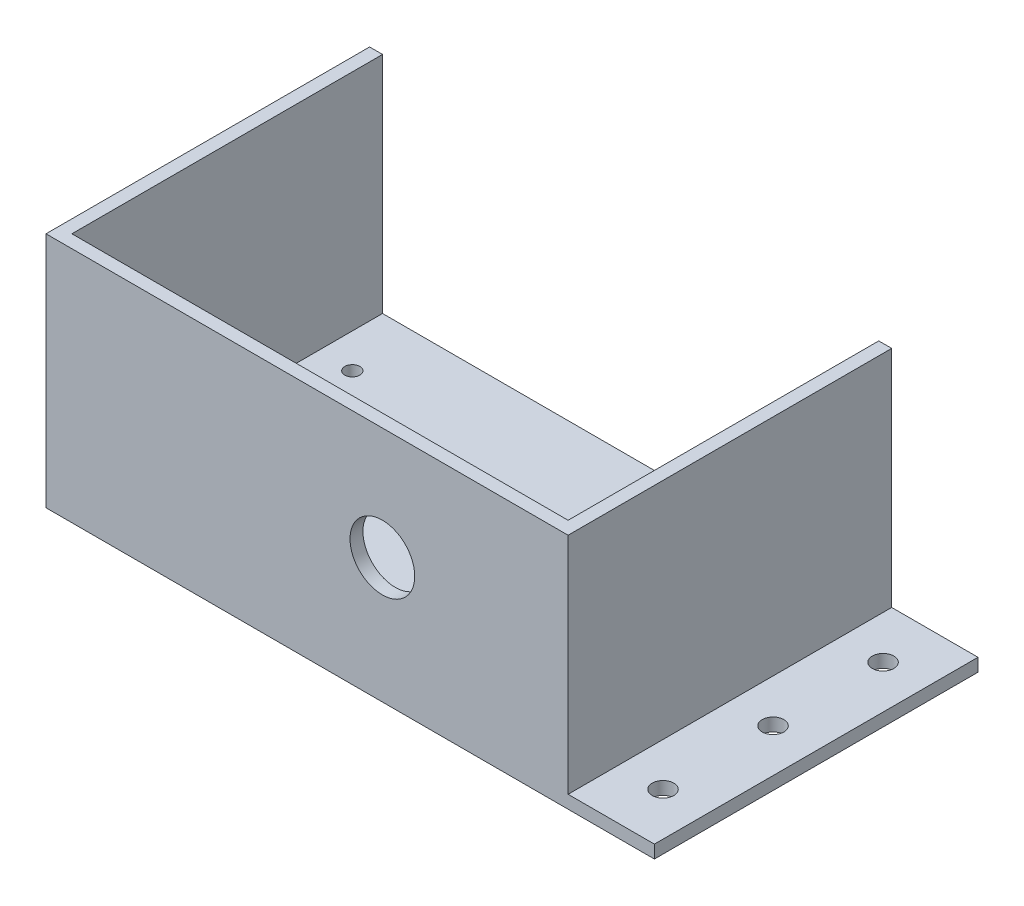
ISO-10303-21;
HEADER;
FILE_DESCRIPTION(('STEP AP214'),'2;1');
FILE_NAME('part.step','',(''),(''),'','','');
FILE_SCHEMA(('AUTOMOTIVE_DESIGN { 1 0 10303 214 1 1 1 1 }'));
ENDSEC;
DATA;
#1=APPLICATION_CONTEXT('core data for automotive mechanical design processes');
#2=APPLICATION_PROTOCOL_DEFINITION('international standard','automotive_design',2000,#1);
#3=PRODUCT_CONTEXT('',#1,'mechanical');
#4=PRODUCT('Part','Part','',(#3));
#5=PRODUCT_RELATED_PRODUCT_CATEGORY('part','',(#4));
#6=PRODUCT_DEFINITION_FORMATION('','',#4);
#7=PRODUCT_DEFINITION_CONTEXT('part definition',#1,'design');
#8=PRODUCT_DEFINITION('design','',#6,#7);
#9=PRODUCT_DEFINITION_SHAPE('','',#8);
#10=(LENGTH_UNIT() NAMED_UNIT(*) SI_UNIT(.MILLI.,.METRE.));
#11=(NAMED_UNIT(*) PLANE_ANGLE_UNIT() SI_UNIT($,.RADIAN.));
#12=(NAMED_UNIT(*) SI_UNIT($,.STERADIAN.) SOLID_ANGLE_UNIT());
#13=UNCERTAINTY_MEASURE_WITH_UNIT(LENGTH_MEASURE(1.E-05),#10,'distance_accuracy_value','');
#14=(GEOMETRIC_REPRESENTATION_CONTEXT(3) GLOBAL_UNCERTAINTY_ASSIGNED_CONTEXT((#13)) GLOBAL_UNIT_ASSIGNED_CONTEXT((#10,
#11,#12)) REPRESENTATION_CONTEXT('',''));
#15=CARTESIAN_POINT('',(0.,0.,0.));
#16=DIRECTION('',(0.,0.,1.));
#17=DIRECTION('',(1.,0.,0.));
#18=AXIS2_PLACEMENT_3D('',#15,#16,#17);
#19=CARTESIAN_POINT('',(121.,58.,0.));
#20=DIRECTION('',(-1.,0.,0.));
#21=DIRECTION('',(0.,0.,1.));
#22=AXIS2_PLACEMENT_3D('',#19,#20,#21);
#23=PLANE('',#22);
#24=DIRECTION('',(0.,-1.,0.));
#25=VECTOR('',#24,1.);
#26=CARTESIAN_POINT('',(121.,58.,-75.));
#27=LINE('',#26,#25);
#28=CARTESIAN_POINT('',(121.,55.,-75.));
#29=VERTEX_POINT('',#28);
#30=CARTESIAN_POINT('',(121.,3.00000000000002,-75.));
#31=VERTEX_POINT('',#30);
#32=EDGE_CURVE('E50',#29,#31,#27,.T.);
#33=ORIENTED_EDGE('',*,*,#32,.F.);
#34=DIRECTION('',(0.,0.,1.));
#35=VECTOR('',#34,1.);
#36=CARTESIAN_POINT('',(121.,55.,-75.));
#37=LINE('',#36,#35);
#38=CARTESIAN_POINT('',(121.,55.,0.));
#39=VERTEX_POINT('',#38);
#40=EDGE_CURVE('E125',#29,#39,#37,.T.);
#41=ORIENTED_EDGE('',*,*,#40,.T.);
#42=DIRECTION('',(0.,-1.,0.));
#43=VECTOR('',#42,1.);
#44=CARTESIAN_POINT('',(121.,58.,0.));
#45=LINE('',#44,#43);
#46=CARTESIAN_POINT('',(121.,3.,0.));
#47=VERTEX_POINT('',#46);
#48=EDGE_CURVE('E42',#39,#47,#45,.T.);
#49=ORIENTED_EDGE('',*,*,#48,.T.);
#50=DIRECTION('',(0.,0.,1.));
#51=VECTOR('',#50,1.);
#52=CARTESIAN_POINT('',(121.,3.,0.));
#53=LINE('',#52,#51);
#54=EDGE_CURVE('E176',#31,#47,#53,.T.);
#55=ORIENTED_EDGE('',*,*,#54,.F.);
#56=EDGE_LOOP('',(#33,#41,#49,#55));
#57=FACE_BOUND('',#56,.T.);
#58=ADVANCED_FACE('F33',(#57),#23,.F.);
#59=CARTESIAN_POINT('',(0.,58.,0.));
#60=DIRECTION('',(1.,0.,0.));
#61=DIRECTION('',(0.,0.,-1.));
#62=AXIS2_PLACEMENT_3D('',#59,#60,#61);
#63=PLANE('',#62);
#64=DIRECTION('',(0.,-1.,0.));
#65=VECTOR('',#64,1.);
#66=CARTESIAN_POINT('',(0.,58.,0.));
#67=LINE('',#66,#65);
#68=CARTESIAN_POINT('',(0.,55.,0.));
#69=VERTEX_POINT('',#68);
#70=CARTESIAN_POINT('',(0.,0.,0.));
#71=VERTEX_POINT('',#70);
#72=EDGE_CURVE('E11',#69,#71,#67,.T.);
#73=ORIENTED_EDGE('',*,*,#72,.F.);
#74=DIRECTION('',(0.,0.,1.));
#75=VECTOR('',#74,1.);
#76=CARTESIAN_POINT('',(0.,55.,-75.));
#77=LINE('',#76,#75);
#78=CARTESIAN_POINT('',(0.,55.,-75.));
#79=VERTEX_POINT('',#78);
#80=EDGE_CURVE('E116',#79,#69,#77,.T.);
#81=ORIENTED_EDGE('',*,*,#80,.F.);
#82=DIRECTION('',(0.,-1.,0.));
#83=VECTOR('',#82,1.);
#84=CARTESIAN_POINT('',(0.,58.,-75.));
#85=LINE('',#84,#83);
#86=CARTESIAN_POINT('',(0.,0.,-75.));
#87=VERTEX_POINT('',#86);
#88=EDGE_CURVE('E58',#79,#87,#85,.T.);
#89=ORIENTED_EDGE('',*,*,#88,.T.);
#90=DIRECTION('',(0.,0.,1.));
#91=VECTOR('',#90,1.);
#92=CARTESIAN_POINT('',(0.,0.,0.));
#93=LINE('',#92,#91);
#94=EDGE_CURVE('E217',#87,#71,#93,.T.);
#95=ORIENTED_EDGE('',*,*,#94,.T.);
#96=EDGE_LOOP('',(#73,#81,#89,#95));
#97=FACE_BOUND('',#96,.T.);
#98=ADVANCED_FACE('F35',(#97),#63,.F.);
#99=CARTESIAN_POINT('',(0.,58.,0.));
#100=DIRECTION('',(0.,0.,-1.));
#101=DIRECTION('',(-1.,0.,0.));
#102=AXIS2_PLACEMENT_3D('',#99,#100,#101);
#103=PLANE('',#102);
#104=CARTESIAN_POINT('',(77.9555837563452,29.,0.));
#105=DIRECTION('',(0.,0.,1.));
#106=DIRECTION('',(1.,0.,0.));
#107=AXIS2_PLACEMENT_3D('',#104,#105,#106);
#108=CIRCLE('',#107,7.50000000000001);
#109=CARTESIAN_POINT('',(85.4555837563452,29.,0.));
#110=VERTEX_POINT('',#109);
#111=EDGE_CURVE('E141',#110,#110,#108,.T.);
#112=ORIENTED_EDGE('',*,*,#111,.F.);
#113=EDGE_LOOP('',(#112));
#114=FACE_BOUND('',#113,.T.);
#115=ORIENTED_EDGE('',*,*,#48,.F.);
#116=DIRECTION('',(1.,0.,0.));
#117=VECTOR('',#116,1.);
#118=CARTESIAN_POINT('',(0.,55.,0.));
#119=LINE('',#118,#117);
#120=EDGE_CURVE('E238',#69,#39,#119,.T.);
#121=ORIENTED_EDGE('',*,*,#120,.F.);
#122=ORIENTED_EDGE('',*,*,#72,.T.);
#123=DIRECTION('',(1.,0.,0.));
#124=VECTOR('',#123,1.);
#125=CARTESIAN_POINT('',(0.,0.,0.));
#126=LINE('',#125,#124);
#127=CARTESIAN_POINT('',(141.,0.,0.));
#128=VERTEX_POINT('',#127);
#129=EDGE_CURVE('E133',#71,#128,#126,.T.);
#130=ORIENTED_EDGE('',*,*,#129,.T.);
#131=DIRECTION('',(0.,-1.,0.));
#132=VECTOR('',#131,1.);
#133=CARTESIAN_POINT('',(141.,0.,0.));
#134=LINE('',#133,#132);
#135=CARTESIAN_POINT('',(141.,3.,0.));
#136=VERTEX_POINT('',#135);
#137=EDGE_CURVE('E177',#136,#128,#134,.T.);
#138=ORIENTED_EDGE('',*,*,#137,.F.);
#139=DIRECTION('',(-1.,0.,0.));
#140=VECTOR('',#139,1.);
#141=CARTESIAN_POINT('',(141.,3.,0.));
#142=LINE('',#141,#140);
#143=EDGE_CURVE('E187',#136,#47,#142,.T.);
#144=ORIENTED_EDGE('',*,*,#143,.T.);
#145=EDGE_LOOP('',(#115,#121,#122,#130,#138,#144));
#146=FACE_BOUND('',#145,.T.);
#147=ADVANCED_FACE('F229',(#114,#146),#103,.F.);
#148=CARTESIAN_POINT('',(0.,58.,-75.));
#149=DIRECTION('',(0.,0.,1.));
#150=DIRECTION('',(1.,0.,0.));
#151=AXIS2_PLACEMENT_3D('',#148,#149,#150);
#152=PLANE('',#151);
#153=ORIENTED_EDGE('',*,*,#88,.F.);
#154=DIRECTION('',(1.,0.,0.));
#155=VECTOR('',#154,1.);
#156=CARTESIAN_POINT('',(0.,55.,-75.));
#157=LINE('',#156,#155);
#158=CARTESIAN_POINT('',(3.,55.,-75.));
#159=VERTEX_POINT('',#158);
#160=EDGE_CURVE('E114',#79,#159,#157,.T.);
#161=ORIENTED_EDGE('',*,*,#160,.T.);
#162=DIRECTION('',(0.,1.,0.));
#163=VECTOR('',#162,1.);
#164=CARTESIAN_POINT('',(3.,3.,-75.));
#165=LINE('',#164,#163);
#166=CARTESIAN_POINT('',(3.,3.,-75.));
#167=VERTEX_POINT('',#166);
#168=EDGE_CURVE('E195',#167,#159,#165,.T.);
#169=ORIENTED_EDGE('',*,*,#168,.F.);
#170=DIRECTION('',(-1.,0.,0.));
#171=VECTOR('',#170,1.);
#172=CARTESIAN_POINT('',(3.,3.,-75.));
#173=LINE('',#172,#171);
#174=CARTESIAN_POINT('',(118.,2.99999999999998,-75.));
#175=VERTEX_POINT('',#174);
#176=EDGE_CURVE('E200',#175,#167,#173,.T.);
#177=ORIENTED_EDGE('',*,*,#176,.F.);
#178=DIRECTION('',(0.,-1.,0.));
#179=VECTOR('',#178,1.);
#180=CARTESIAN_POINT('',(118.,2.99999999999998,-75.));
#181=LINE('',#180,#179);
#182=CARTESIAN_POINT('',(118.,55.,-75.));
#183=VERTEX_POINT('',#182);
#184=EDGE_CURVE('E210',#183,#175,#181,.T.);
#185=ORIENTED_EDGE('',*,*,#184,.F.);
#186=EDGE_CURVE('E122',#183,#29,#157,.T.);
#187=ORIENTED_EDGE('',*,*,#186,.T.);
#188=ORIENTED_EDGE('',*,*,#32,.T.);
#189=DIRECTION('',(-1.,0.,0.));
#190=VECTOR('',#189,1.);
#191=CARTESIAN_POINT('',(141.,3.,-75.));
#192=LINE('',#191,#190);
#193=CARTESIAN_POINT('',(141.,3.,-75.));
#194=VERTEX_POINT('',#193);
#195=EDGE_CURVE('E192',#194,#31,#192,.T.);
#196=ORIENTED_EDGE('',*,*,#195,.F.);
#197=DIRECTION('',(0.,1.,0.));
#198=VECTOR('',#197,1.);
#199=CARTESIAN_POINT('',(141.,0.,-75.));
#200=LINE('',#199,#198);
#201=CARTESIAN_POINT('',(141.,0.,-75.));
#202=VERTEX_POINT('',#201);
#203=EDGE_CURVE('E183',#202,#194,#200,.T.);
#204=ORIENTED_EDGE('',*,*,#203,.F.);
#205=DIRECTION('',(-1.,0.,0.));
#206=VECTOR('',#205,1.);
#207=CARTESIAN_POINT('',(0.,0.,-75.));
#208=LINE('',#207,#206);
#209=EDGE_CURVE('E129',#202,#87,#208,.T.);
#210=ORIENTED_EDGE('',*,*,#209,.T.);
#211=EDGE_LOOP('',(#153,#161,#169,#177,#185,#187,#188,#196,#204,#210));
#212=FACE_BOUND('',#211,.T.);
#213=ADVANCED_FACE('F127',(#212),#152,.F.);
#214=CARTESIAN_POINT('',(0.,0.,0.));
#215=DIRECTION('',(0.,-1.,0.));
#216=DIRECTION('',(0.,0.,-1.));
#217=AXIS2_PLACEMENT_3D('',#214,#215,#216);
#218=PLANE('',#217);
#219=CARTESIAN_POINT('',(11.,0.,-60.));
#220=DIRECTION('',(0.,-1.,0.));
#221=DIRECTION('',(0.,0.,-1.));
#222=AXIS2_PLACEMENT_3D('',#219,#220,#221);
#223=CIRCLE('',#222,1.75);
#224=CARTESIAN_POINT('',(11.,0.,-61.75));
#225=VERTEX_POINT('',#224);
#226=EDGE_CURVE('E144',#225,#225,#223,.T.);
#227=ORIENTED_EDGE('',*,*,#226,.F.);
#228=EDGE_LOOP('',(#227));
#229=FACE_BOUND('',#228,.T.);
#230=CARTESIAN_POINT('',(110.,0.,-60.));
#231=DIRECTION('',(0.,-1.,0.));
#232=DIRECTION('',(0.,0.,-1.));
#233=AXIS2_PLACEMENT_3D('',#230,#231,#232);
#234=CIRCLE('',#233,1.75);
#235=CARTESIAN_POINT('',(110.,0.,-61.75));
#236=VERTEX_POINT('',#235);
#237=EDGE_CURVE('E149',#236,#236,#234,.T.);
#238=ORIENTED_EDGE('',*,*,#237,.F.);
#239=EDGE_LOOP('',(#238));
#240=FACE_BOUND('',#239,.T.);
#241=CARTESIAN_POINT('',(131.,0.,-63.));
#242=DIRECTION('',(0.,-1.,0.));
#243=DIRECTION('',(0.,0.,-1.));
#244=AXIS2_PLACEMENT_3D('',#241,#242,#243);
#245=CIRCLE('',#244,2.5);
#246=CARTESIAN_POINT('',(131.,0.,-65.5));
#247=VERTEX_POINT('',#246);
#248=EDGE_CURVE('E173',#247,#247,#245,.T.);
#249=ORIENTED_EDGE('',*,*,#248,.F.);
#250=EDGE_LOOP('',(#249));
#251=FACE_BOUND('',#250,.T.);
#252=CARTESIAN_POINT('',(131.,0.,-37.5));
#253=DIRECTION('',(0.,-1.,0.));
#254=DIRECTION('',(0.,0.,-1.));
#255=AXIS2_PLACEMENT_3D('',#252,#253,#254);
#256=CIRCLE('',#255,2.5);
#257=CARTESIAN_POINT('',(131.,0.,-40.));
#258=VERTEX_POINT('',#257);
#259=EDGE_CURVE('E170',#258,#258,#256,.T.);
#260=ORIENTED_EDGE('',*,*,#259,.F.);
#261=EDGE_LOOP('',(#260));
#262=FACE_BOUND('',#261,.T.);
#263=CARTESIAN_POINT('',(131.,0.,-12.));
#264=DIRECTION('',(0.,-1.,0.));
#265=DIRECTION('',(0.,0.,-1.));
#266=AXIS2_PLACEMENT_3D('',#263,#264,#265);
#267=CIRCLE('',#266,2.5);
#268=CARTESIAN_POINT('',(131.,0.,-14.5));
#269=VERTEX_POINT('',#268);
#270=EDGE_CURVE('E162',#269,#269,#267,.T.);
#271=ORIENTED_EDGE('',*,*,#270,.F.);
#272=EDGE_LOOP('',(#271));
#273=FACE_BOUND('',#272,.T.);
#274=ORIENTED_EDGE('',*,*,#94,.F.);
#275=ORIENTED_EDGE('',*,*,#209,.F.);
#276=DIRECTION('',(0.,0.,-1.));
#277=VECTOR('',#276,1.);
#278=CARTESIAN_POINT('',(141.,0.,0.));
#279=LINE('',#278,#277);
#280=EDGE_CURVE('E180',#128,#202,#279,.T.);
#281=ORIENTED_EDGE('',*,*,#280,.F.);
#282=ORIENTED_EDGE('',*,*,#129,.F.);
#283=EDGE_LOOP('',(#274,#275,#281,#282));
#284=FACE_BOUND('',#283,.T.);
#285=ADVANCED_FACE('F231',(#229,#240,#251,#262,#273,#284),#218,.T.);
#286=CARTESIAN_POINT('',(3.,3.,-3.));
#287=DIRECTION('',(-1.,0.,0.));
#288=DIRECTION('',(0.,-1.,0.));
#289=AXIS2_PLACEMENT_3D('',#286,#287,#288);
#290=PLANE('',#289);
#291=ORIENTED_EDGE('',*,*,#168,.T.);
#292=DIRECTION('',(0.,0.,-1.));
#293=VECTOR('',#292,1.);
#294=CARTESIAN_POINT('',(3.,55.,-3.));
#295=LINE('',#294,#293);
#296=CARTESIAN_POINT('',(3.,55.,-3.));
#297=VERTEX_POINT('',#296);
#298=EDGE_CURVE('E119',#297,#159,#295,.T.);
#299=ORIENTED_EDGE('',*,*,#298,.F.);
#300=DIRECTION('',(0.,1.,0.));
#301=VECTOR('',#300,1.);
#302=CARTESIAN_POINT('',(3.,3.,-3.));
#303=LINE('',#302,#301);
#304=CARTESIAN_POINT('',(3.,3.,-3.));
#305=VERTEX_POINT('',#304);
#306=EDGE_CURVE('E196',#305,#297,#303,.T.);
#307=ORIENTED_EDGE('',*,*,#306,.F.);
#308=DIRECTION('',(0.,0.,-1.));
#309=VECTOR('',#308,1.);
#310=CARTESIAN_POINT('',(3.,3.,-3.));
#311=LINE('',#310,#309);
#312=EDGE_CURVE('E215',#305,#167,#311,.T.);
#313=ORIENTED_EDGE('',*,*,#312,.T.);
#314=EDGE_LOOP('',(#291,#299,#307,#313));
#315=FACE_BOUND('',#314,.T.);
#316=ADVANCED_FACE('F252',(#315),#290,.F.);
#317=CARTESIAN_POINT('',(3.,3.,-3.));
#318=DIRECTION('',(0.,-1.,0.));
#319=DIRECTION('',(1.,0.,0.));
#320=AXIS2_PLACEMENT_3D('',#317,#318,#319);
#321=PLANE('',#320);
#322=CARTESIAN_POINT('',(11.,3.,-60.));
#323=DIRECTION('',(0.,-1.,0.));
#324=DIRECTION('',(1.,0.,0.));
#325=AXIS2_PLACEMENT_3D('',#322,#323,#324);
#326=CIRCLE('',#325,1.75);
#327=CARTESIAN_POINT('',(12.75,3.,-60.));
#328=VERTEX_POINT('',#327);
#329=EDGE_CURVE('E37',#328,#328,#326,.T.);
#330=ORIENTED_EDGE('',*,*,#329,.T.);
#331=EDGE_LOOP('',(#330));
#332=FACE_BOUND('',#331,.T.);
#333=CARTESIAN_POINT('',(110.,2.99999999999998,-60.));
#334=DIRECTION('',(0.,-1.,0.));
#335=DIRECTION('',(1.,0.,0.));
#336=AXIS2_PLACEMENT_3D('',#333,#334,#335);
#337=CIRCLE('',#336,1.75);
#338=CARTESIAN_POINT('',(111.75,2.99999999999998,-60.));
#339=VERTEX_POINT('',#338);
#340=EDGE_CURVE('E142',#339,#339,#337,.T.);
#341=ORIENTED_EDGE('',*,*,#340,.T.);
#342=EDGE_LOOP('',(#341));
#343=FACE_BOUND('',#342,.T.);
#344=ORIENTED_EDGE('',*,*,#176,.T.);
#345=ORIENTED_EDGE('',*,*,#312,.F.);
#346=DIRECTION('',(-1.,0.,0.));
#347=VECTOR('',#346,1.);
#348=CARTESIAN_POINT('',(3.,3.,-3.));
#349=LINE('',#348,#347);
#350=CARTESIAN_POINT('',(118.,2.99999999999998,-3.));
#351=VERTEX_POINT('',#350);
#352=EDGE_CURVE('E206',#351,#305,#349,.T.);
#353=ORIENTED_EDGE('',*,*,#352,.F.);
#354=DIRECTION('',(0.,0.,-1.));
#355=VECTOR('',#354,1.);
#356=CARTESIAN_POINT('',(118.,2.99999999999998,-3.));
#357=LINE('',#356,#355);
#358=EDGE_CURVE('E218',#351,#175,#357,.T.);
#359=ORIENTED_EDGE('',*,*,#358,.T.);
#360=EDGE_LOOP('',(#344,#345,#353,#359));
#361=FACE_BOUND('',#360,.T.);
#362=ADVANCED_FACE('F254',(#332,#343,#361),#321,.F.);
#363=CARTESIAN_POINT('',(118.,2.99999999999998,-3.));
#364=DIRECTION('',(1.,0.,0.));
#365=DIRECTION('',(0.,0.,-1.));
#366=AXIS2_PLACEMENT_3D('',#363,#364,#365);
#367=PLANE('',#366);
#368=ORIENTED_EDGE('',*,*,#184,.T.);
#369=ORIENTED_EDGE('',*,*,#358,.F.);
#370=DIRECTION('',(0.,-1.,0.));
#371=VECTOR('',#370,1.);
#372=CARTESIAN_POINT('',(118.,2.99999999999998,-3.));
#373=LINE('',#372,#371);
#374=CARTESIAN_POINT('',(118.,55.,-3.));
#375=VERTEX_POINT('',#374);
#376=EDGE_CURVE('E203',#375,#351,#373,.T.);
#377=ORIENTED_EDGE('',*,*,#376,.F.);
#378=DIRECTION('',(0.,0.,-1.));
#379=VECTOR('',#378,1.);
#380=CARTESIAN_POINT('',(118.,55.,-3.));
#381=LINE('',#380,#379);
#382=EDGE_CURVE('E220',#375,#183,#381,.T.);
#383=ORIENTED_EDGE('',*,*,#382,.T.);
#384=EDGE_LOOP('',(#368,#369,#377,#383));
#385=FACE_BOUND('',#384,.T.);
#386=ADVANCED_FACE('F246',(#385),#367,.F.);
#387=CARTESIAN_POINT('',(0.,0.,-3.));
#388=DIRECTION('',(0.,0.,-1.));
#389=DIRECTION('',(-1.,0.,0.));
#390=AXIS2_PLACEMENT_3D('',#387,#388,#389);
#391=PLANE('',#390);
#392=CARTESIAN_POINT('',(77.9555837563452,29.,-3.));
#393=DIRECTION('',(0.,0.,-1.));
#394=DIRECTION('',(-1.,0.,0.));
#395=AXIS2_PLACEMENT_3D('',#392,#393,#394);
#396=CIRCLE('',#395,7.50000000000001);
#397=CARTESIAN_POINT('',(70.4555837563452,29.,-3.));
#398=VERTEX_POINT('',#397);
#399=EDGE_CURVE('E138',#398,#398,#396,.T.);
#400=ORIENTED_EDGE('',*,*,#399,.F.);
#401=EDGE_LOOP('',(#400));
#402=FACE_BOUND('',#401,.T.);
#403=ORIENTED_EDGE('',*,*,#306,.T.);
#404=DIRECTION('',(1.,0.,0.));
#405=VECTOR('',#404,1.);
#406=CARTESIAN_POINT('',(3.,55.,-3.));
#407=LINE('',#406,#405);
#408=EDGE_CURVE('E199',#297,#375,#407,.T.);
#409=ORIENTED_EDGE('',*,*,#408,.T.);
#410=ORIENTED_EDGE('',*,*,#376,.T.);
#411=ORIENTED_EDGE('',*,*,#352,.T.);
#412=EDGE_LOOP('',(#403,#409,#410,#411));
#413=FACE_BOUND('',#412,.T.);
#414=ADVANCED_FACE('F249',(#402,#413),#391,.T.);
#415=CARTESIAN_POINT('',(141.,3.,0.));
#416=DIRECTION('',(0.,-1.,0.));
#417=DIRECTION('',(0.,0.,-1.));
#418=AXIS2_PLACEMENT_3D('',#415,#416,#417);
#419=PLANE('',#418);
#420=CARTESIAN_POINT('',(131.,3.,-63.));
#421=DIRECTION('',(0.,1.,0.));
#422=DIRECTION('',(0.,0.,1.));
#423=AXIS2_PLACEMENT_3D('',#420,#421,#422);
#424=CIRCLE('',#423,2.5);
#425=CARTESIAN_POINT('',(131.,3.,-60.5));
#426=VERTEX_POINT('',#425);
#427=EDGE_CURVE('E159',#426,#426,#424,.T.);
#428=ORIENTED_EDGE('',*,*,#427,.F.);
#429=EDGE_LOOP('',(#428));
#430=FACE_BOUND('',#429,.T.);
#431=CARTESIAN_POINT('',(131.,3.,-37.5));
#432=DIRECTION('',(0.,1.,0.));
#433=DIRECTION('',(0.,0.,1.));
#434=AXIS2_PLACEMENT_3D('',#431,#432,#433);
#435=CIRCLE('',#434,2.5);
#436=CARTESIAN_POINT('',(131.,3.,-35.));
#437=VERTEX_POINT('',#436);
#438=EDGE_CURVE('E163',#437,#437,#435,.T.);
#439=ORIENTED_EDGE('',*,*,#438,.F.);
#440=EDGE_LOOP('',(#439));
#441=FACE_BOUND('',#440,.T.);
#442=CARTESIAN_POINT('',(131.,3.,-12.));
#443=DIRECTION('',(0.,1.,0.));
#444=DIRECTION('',(0.,0.,1.));
#445=AXIS2_PLACEMENT_3D('',#442,#443,#444);
#446=CIRCLE('',#445,2.5);
#447=CARTESIAN_POINT('',(131.,3.,-9.50000000000001));
#448=VERTEX_POINT('',#447);
#449=EDGE_CURVE('E140',#448,#448,#446,.T.);
#450=ORIENTED_EDGE('',*,*,#449,.F.);
#451=EDGE_LOOP('',(#450));
#452=FACE_BOUND('',#451,.T.);
#453=ORIENTED_EDGE('',*,*,#54,.T.);
#454=ORIENTED_EDGE('',*,*,#143,.F.);
#455=DIRECTION('',(0.,0.,1.));
#456=VECTOR('',#455,1.);
#457=CARTESIAN_POINT('',(141.,3.,0.));
#458=LINE('',#457,#456);
#459=EDGE_CURVE('E185',#194,#136,#458,.T.);
#460=ORIENTED_EDGE('',*,*,#459,.F.);
#461=ORIENTED_EDGE('',*,*,#195,.T.);
#462=EDGE_LOOP('',(#453,#454,#460,#461));
#463=FACE_BOUND('',#462,.T.);
#464=ADVANCED_FACE('F237',(#430,#441,#452,#463),#419,.F.);
#465=CARTESIAN_POINT('',(141.,0.,0.));
#466=DIRECTION('',(-1.,0.,0.));
#467=DIRECTION('',(0.,0.,1.));
#468=AXIS2_PLACEMENT_3D('',#465,#466,#467);
#469=PLANE('',#468);
#470=ORIENTED_EDGE('',*,*,#137,.T.);
#471=ORIENTED_EDGE('',*,*,#280,.T.);
#472=ORIENTED_EDGE('',*,*,#203,.T.);
#473=ORIENTED_EDGE('',*,*,#459,.T.);
#474=EDGE_LOOP('',(#470,#471,#472,#473));
#475=FACE_BOUND('',#474,.T.);
#476=ADVANCED_FACE('F233',(#475),#469,.F.);
#477=CARTESIAN_POINT('',(131.,-17.,-12.));
#478=DIRECTION('',(0.,1.,0.));
#479=DIRECTION('',(0.,0.,1.));
#480=AXIS2_PLACEMENT_3D('',#477,#478,#479);
#481=CYLINDRICAL_SURFACE('',#480,2.5);
#482=ORIENTED_EDGE('',*,*,#270,.T.);
#483=EDGE_LOOP('',(#482));
#484=FACE_BOUND('',#483,.T.);
#485=ORIENTED_EDGE('',*,*,#449,.T.);
#486=EDGE_LOOP('',(#485));
#487=FACE_BOUND('',#486,.T.);
#488=ADVANCED_FACE('F299',(#484,#487),#481,.F.);
#489=CARTESIAN_POINT('',(131.,-17.,-37.5));
#490=DIRECTION('',(0.,1.,0.));
#491=DIRECTION('',(0.,0.,1.));
#492=AXIS2_PLACEMENT_3D('',#489,#490,#491);
#493=CYLINDRICAL_SURFACE('',#492,2.5);
#494=ORIENTED_EDGE('',*,*,#259,.T.);
#495=EDGE_LOOP('',(#494));
#496=FACE_BOUND('',#495,.T.);
#497=ORIENTED_EDGE('',*,*,#438,.T.);
#498=EDGE_LOOP('',(#497));
#499=FACE_BOUND('',#498,.T.);
#500=ADVANCED_FACE('F292',(#496,#499),#493,.F.);
#501=CARTESIAN_POINT('',(131.,-17.,-63.));
#502=DIRECTION('',(0.,1.,0.));
#503=DIRECTION('',(0.,0.,1.));
#504=AXIS2_PLACEMENT_3D('',#501,#502,#503);
#505=CYLINDRICAL_SURFACE('',#504,2.5);
#506=ORIENTED_EDGE('',*,*,#248,.T.);
#507=EDGE_LOOP('',(#506));
#508=FACE_BOUND('',#507,.T.);
#509=ORIENTED_EDGE('',*,*,#427,.T.);
#510=EDGE_LOOP('',(#509));
#511=FACE_BOUND('',#510,.T.);
#512=ADVANCED_FACE('F282',(#508,#511),#505,.F.);
#513=CARTESIAN_POINT('',(77.9555837563452,29.,-5.));
#514=DIRECTION('',(0.,0.,1.));
#515=DIRECTION('',(1.,0.,0.));
#516=AXIS2_PLACEMENT_3D('',#513,#514,#515);
#517=CYLINDRICAL_SURFACE('',#516,7.50000000000001);
#518=ORIENTED_EDGE('',*,*,#399,.T.);
#519=EDGE_LOOP('',(#518));
#520=FACE_BOUND('',#519,.T.);
#521=ORIENTED_EDGE('',*,*,#111,.T.);
#522=EDGE_LOOP('',(#521));
#523=FACE_BOUND('',#522,.T.);
#524=ADVANCED_FACE('F279',(#520,#523),#517,.F.);
#525=CARTESIAN_POINT('',(110.,5.,-60.));
#526=DIRECTION('',(0.,-1.,0.));
#527=DIRECTION('',(0.,0.,-1.));
#528=AXIS2_PLACEMENT_3D('',#525,#526,#527);
#529=CYLINDRICAL_SURFACE('',#528,1.75);
#530=ORIENTED_EDGE('',*,*,#237,.T.);
#531=EDGE_LOOP('',(#530));
#532=FACE_BOUND('',#531,.T.);
#533=ORIENTED_EDGE('',*,*,#340,.F.);
#534=EDGE_LOOP('',(#533));
#535=FACE_BOUND('',#534,.T.);
#536=ADVANCED_FACE('F281',(#532,#535),#529,.F.);
#537=CARTESIAN_POINT('',(11.,5.,-60.));
#538=DIRECTION('',(0.,-1.,0.));
#539=DIRECTION('',(0.,0.,-1.));
#540=AXIS2_PLACEMENT_3D('',#537,#538,#539);
#541=CYLINDRICAL_SURFACE('',#540,1.75);
#542=ORIENTED_EDGE('',*,*,#226,.T.);
#543=EDGE_LOOP('',(#542));
#544=FACE_BOUND('',#543,.T.);
#545=ORIENTED_EDGE('',*,*,#329,.F.);
#546=EDGE_LOOP('',(#545));
#547=FACE_BOUND('',#546,.T.);
#548=ADVANCED_FACE('F289',(#544,#547),#541,.F.);
#549=CARTESIAN_POINT('',(0.,55.,-75.));
#550=DIRECTION('',(0.,-1.,0.));
#551=DIRECTION('',(0.,0.,-1.));
#552=AXIS2_PLACEMENT_3D('',#549,#550,#551);
#553=PLANE('',#552);
#554=ORIENTED_EDGE('',*,*,#160,.F.);
#555=ORIENTED_EDGE('',*,*,#80,.T.);
#556=ORIENTED_EDGE('',*,*,#120,.T.);
#557=ORIENTED_EDGE('',*,*,#40,.F.);
#558=ORIENTED_EDGE('',*,*,#186,.F.);
#559=ORIENTED_EDGE('',*,*,#382,.F.);
#560=ORIENTED_EDGE('',*,*,#408,.F.);
#561=ORIENTED_EDGE('',*,*,#298,.T.);
#562=EDGE_LOOP('',(#554,#555,#556,#557,#558,#559,#560,#561));
#563=FACE_BOUND('',#562,.T.);
#564=ADVANCED_FACE('F115',(#563),#553,.F.);
#565=CLOSED_SHELL('',(#58,#98,#147,#213,#285,#316,#362,#386,#414,#464,#476,#488,#500,#512,#524,
#536,#548,#564));
#566=MANIFOLD_SOLID_BREP('B2',#565);
#567=ADVANCED_BREP_SHAPE_REPRESENTATION('',(#18,#566),#14);
#568=SHAPE_DEFINITION_REPRESENTATION(#9,#567);
ENDSEC;
END-ISO-10303-21;
